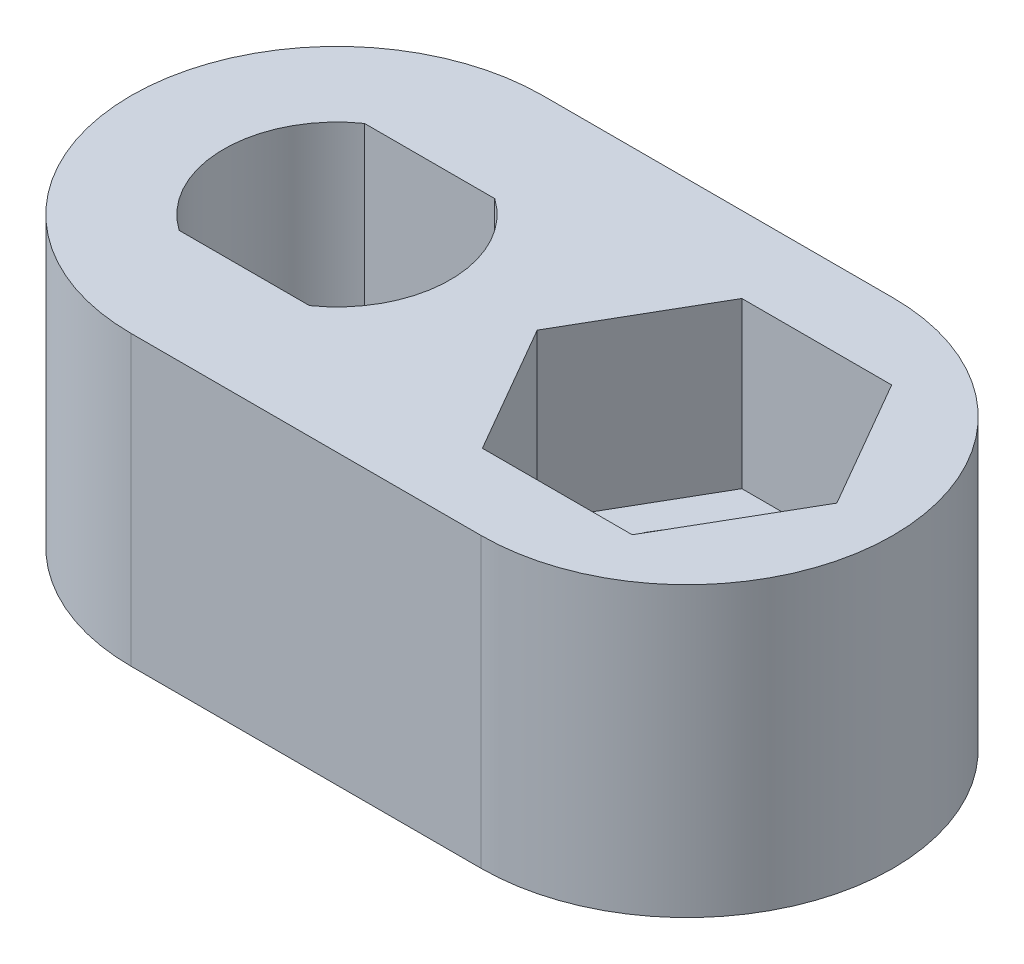
ISO-10303-21;
HEADER;
FILE_DESCRIPTION(('STEP AP214'),'2;1');
FILE_NAME('part.step','',(''),(''),'','','');
FILE_SCHEMA(('AUTOMOTIVE_DESIGN { 1 0 10303 214 1 1 1 1 }'));
ENDSEC;
DATA;
#1=APPLICATION_CONTEXT('core data for automotive mechanical design processes');
#2=APPLICATION_PROTOCOL_DEFINITION('international standard','automotive_design',2000,#1);
#3=PRODUCT_CONTEXT('',#1,'mechanical');
#4=PRODUCT('Part','Part','',(#3));
#5=PRODUCT_RELATED_PRODUCT_CATEGORY('part','',(#4));
#6=PRODUCT_DEFINITION_FORMATION('','',#4);
#7=PRODUCT_DEFINITION_CONTEXT('part definition',#1,'design');
#8=PRODUCT_DEFINITION('design','',#6,#7);
#9=PRODUCT_DEFINITION_SHAPE('','',#8);
#10=(LENGTH_UNIT() NAMED_UNIT(*) SI_UNIT(.MILLI.,.METRE.));
#11=(NAMED_UNIT(*) PLANE_ANGLE_UNIT() SI_UNIT($,.RADIAN.));
#12=(NAMED_UNIT(*) SI_UNIT($,.STERADIAN.) SOLID_ANGLE_UNIT());
#13=UNCERTAINTY_MEASURE_WITH_UNIT(LENGTH_MEASURE(1.E-05),#10,'distance_accuracy_value','');
#14=(GEOMETRIC_REPRESENTATION_CONTEXT(3) GLOBAL_UNCERTAINTY_ASSIGNED_CONTEXT((#13)) GLOBAL_UNIT_ASSIGNED_CONTEXT((#10,
#11,#12)) REPRESENTATION_CONTEXT('',''));
#15=CARTESIAN_POINT('',(0.,0.,0.));
#16=DIRECTION('',(0.,0.,1.));
#17=DIRECTION('',(1.,0.,0.));
#18=AXIS2_PLACEMENT_3D('',#15,#16,#17);
#19=CARTESIAN_POINT('',(8.5,0.,0.));
#20=DIRECTION('',(0.,-1.,0.));
#21=DIRECTION('',(0.,0.,-1.));
#22=AXIS2_PLACEMENT_3D('',#19,#20,#21);
#23=CYLINDRICAL_SURFACE('',#22,2.32500000000001);
#24=CARTESIAN_POINT('',(8.5,0.,0.));
#25=DIRECTION('',(0.,-1.,0.));
#26=DIRECTION('',(0.,0.,-1.));
#27=AXIS2_PLACEMENT_3D('',#24,#25,#26);
#28=CIRCLE('',#27,2.32500000000001);
#29=CARTESIAN_POINT('',(8.5,0.,-2.32500000000001));
#30=VERTEX_POINT('',#29);
#31=EDGE_CURVE('E216',#30,#30,#28,.T.);
#32=ORIENTED_EDGE('',*,*,#31,.T.);
#33=EDGE_LOOP('',(#32));
#34=FACE_BOUND('',#33,.T.);
#35=CARTESIAN_POINT('',(8.5,3.,0.));
#36=DIRECTION('',(0.,1.,0.));
#37=DIRECTION('',(0.,0.,1.));
#38=AXIS2_PLACEMENT_3D('',#35,#36,#37);
#39=CIRCLE('',#38,2.32500000000001);
#40=CARTESIAN_POINT('',(8.5,3.,2.32500000000001));
#41=VERTEX_POINT('',#40);
#42=EDGE_CURVE('E43',#41,#41,#39,.F.);
#43=ORIENTED_EDGE('',*,*,#42,.F.);
#44=EDGE_LOOP('',(#43));
#45=FACE_BOUND('',#44,.T.);
#46=ADVANCED_FACE('F39',(#34,#45),#23,.F.);
#47=CARTESIAN_POINT('',(0.,7.,0.));
#48=DIRECTION('',(0.,-1.,0.));
#49=DIRECTION('',(0.,0.,-1.));
#50=AXIS2_PLACEMENT_3D('',#47,#48,#49);
#51=CYLINDRICAL_SURFACE('',#50,5.);
#52=CARTESIAN_POINT('',(0.,0.,0.));
#53=DIRECTION('',(0.,1.,0.));
#54=DIRECTION('',(0.,0.,1.));
#55=AXIS2_PLACEMENT_3D('',#52,#53,#54);
#56=CIRCLE('',#55,5.);
#57=CARTESIAN_POINT('',(0.,0.,-5.));
#58=VERTEX_POINT('',#57);
#59=CARTESIAN_POINT('',(0.,0.,5.));
#60=VERTEX_POINT('',#59);
#61=EDGE_CURVE('E257',#58,#60,#56,.T.);
#62=ORIENTED_EDGE('',*,*,#61,.T.);
#63=DIRECTION('',(0.,-1.,0.));
#64=VECTOR('',#63,1.);
#65=CARTESIAN_POINT('',(0.,7.,5.));
#66=LINE('',#65,#64);
#67=CARTESIAN_POINT('',(0.,7.,5.));
#68=VERTEX_POINT('',#67);
#69=EDGE_CURVE('E11',#68,#60,#66,.T.);
#70=ORIENTED_EDGE('',*,*,#69,.F.);
#71=CARTESIAN_POINT('',(0.,7.,0.));
#72=DIRECTION('',(0.,1.,0.));
#73=DIRECTION('',(0.,0.,1.));
#74=AXIS2_PLACEMENT_3D('',#71,#72,#73);
#75=CIRCLE('',#74,5.);
#76=CARTESIAN_POINT('',(0.,7.,-5.));
#77=VERTEX_POINT('',#76);
#78=EDGE_CURVE('E266',#77,#68,#75,.T.);
#79=ORIENTED_EDGE('',*,*,#78,.F.);
#80=DIRECTION('',(0.,-1.,0.));
#81=VECTOR('',#80,1.);
#82=CARTESIAN_POINT('',(0.,7.,-5.));
#83=LINE('',#82,#81);
#84=EDGE_CURVE('E280',#77,#58,#83,.T.);
#85=ORIENTED_EDGE('',*,*,#84,.T.);
#86=EDGE_LOOP('',(#62,#70,#79,#85));
#87=FACE_BOUND('',#86,.T.);
#88=ADVANCED_FACE('F41',(#87),#51,.T.);
#89=CARTESIAN_POINT('',(0.,7.,5.));
#90=DIRECTION('',(0.,0.,-1.));
#91=DIRECTION('',(-1.,0.,0.));
#92=AXIS2_PLACEMENT_3D('',#89,#90,#91);
#93=PLANE('',#92);
#94=DIRECTION('',(1.,0.,0.));
#95=VECTOR('',#94,1.);
#96=CARTESIAN_POINT('',(0.,0.,5.));
#97=LINE('',#96,#95);
#98=CARTESIAN_POINT('',(8.5,0.,5.));
#99=VERTEX_POINT('',#98);
#100=EDGE_CURVE('E284',#60,#99,#97,.T.);
#101=ORIENTED_EDGE('',*,*,#100,.T.);
#102=DIRECTION('',(0.,-1.,0.));
#103=VECTOR('',#102,1.);
#104=CARTESIAN_POINT('',(8.5,7.,5.));
#105=LINE('',#104,#103);
#106=CARTESIAN_POINT('',(8.5,7.,5.));
#107=VERTEX_POINT('',#106);
#108=EDGE_CURVE('E49',#107,#99,#105,.T.);
#109=ORIENTED_EDGE('',*,*,#108,.F.);
#110=DIRECTION('',(1.,0.,0.));
#111=VECTOR('',#110,1.);
#112=CARTESIAN_POINT('',(0.,7.,5.));
#113=LINE('',#112,#111);
#114=EDGE_CURVE('E270',#68,#107,#113,.T.);
#115=ORIENTED_EDGE('',*,*,#114,.F.);
#116=ORIENTED_EDGE('',*,*,#69,.T.);
#117=EDGE_LOOP('',(#101,#109,#115,#116));
#118=FACE_BOUND('',#117,.T.);
#119=ADVANCED_FACE('F347',(#118),#93,.F.);
#120=CARTESIAN_POINT('',(8.5,7.,0.));
#121=DIRECTION('',(0.,-1.,0.));
#122=DIRECTION('',(0.,0.,-1.));
#123=AXIS2_PLACEMENT_3D('',#120,#121,#122);
#124=CYLINDRICAL_SURFACE('',#123,5.);
#125=CARTESIAN_POINT('',(8.5,0.,0.));
#126=DIRECTION('',(0.,1.,0.));
#127=DIRECTION('',(0.,0.,1.));
#128=AXIS2_PLACEMENT_3D('',#125,#126,#127);
#129=CIRCLE('',#128,5.);
#130=CARTESIAN_POINT('',(8.5,0.,-5.));
#131=VERTEX_POINT('',#130);
#132=EDGE_CURVE('E287',#99,#131,#129,.T.);
#133=ORIENTED_EDGE('',*,*,#132,.T.);
#134=DIRECTION('',(0.,-1.,0.));
#135=VECTOR('',#134,1.);
#136=CARTESIAN_POINT('',(8.5,7.,-5.));
#137=LINE('',#136,#135);
#138=CARTESIAN_POINT('',(8.5,7.,-5.));
#139=VERTEX_POINT('',#138);
#140=EDGE_CURVE('E295',#139,#131,#137,.T.);
#141=ORIENTED_EDGE('',*,*,#140,.F.);
#142=CARTESIAN_POINT('',(8.5,7.,0.));
#143=DIRECTION('',(0.,1.,0.));
#144=DIRECTION('',(0.,0.,1.));
#145=AXIS2_PLACEMENT_3D('',#142,#143,#144);
#146=CIRCLE('',#145,5.);
#147=EDGE_CURVE('E274',#107,#139,#146,.T.);
#148=ORIENTED_EDGE('',*,*,#147,.F.);
#149=ORIENTED_EDGE('',*,*,#108,.T.);
#150=EDGE_LOOP('',(#133,#141,#148,#149));
#151=FACE_BOUND('',#150,.T.);
#152=ADVANCED_FACE('F479',(#151),#124,.T.);
#153=CARTESIAN_POINT('',(0.,7.,-5.));
#154=DIRECTION('',(0.,0.,1.));
#155=DIRECTION('',(1.,0.,0.));
#156=AXIS2_PLACEMENT_3D('',#153,#154,#155);
#157=PLANE('',#156);
#158=DIRECTION('',(-1.,0.,0.));
#159=VECTOR('',#158,1.);
#160=CARTESIAN_POINT('',(0.,0.,-5.));
#161=LINE('',#160,#159);
#162=EDGE_CURVE('E271',#131,#58,#161,.T.);
#163=ORIENTED_EDGE('',*,*,#162,.T.);
#164=ORIENTED_EDGE('',*,*,#84,.F.);
#165=DIRECTION('',(-1.,0.,0.));
#166=VECTOR('',#165,1.);
#167=CARTESIAN_POINT('',(0.,7.,-5.));
#168=LINE('',#167,#166);
#169=EDGE_CURVE('E277',#139,#77,#168,.T.);
#170=ORIENTED_EDGE('',*,*,#169,.F.);
#171=ORIENTED_EDGE('',*,*,#140,.T.);
#172=EDGE_LOOP('',(#163,#164,#170,#171));
#173=FACE_BOUND('',#172,.T.);
#174=ADVANCED_FACE('F474',(#173),#157,.F.);
#175=CARTESIAN_POINT('',(0.,7.,0.));
#176=DIRECTION('',(0.,1.,0.));
#177=DIRECTION('',(0.,0.,1.));
#178=AXIS2_PLACEMENT_3D('',#175,#176,#177);
#179=PLANE('',#178);
#180=DIRECTION('',(-0.5,0.,-0.866025403784439));
#181=VECTOR('',#180,1.);
#182=CARTESIAN_POINT('',(12.1373066958947,7.,1.15119827571368E-12));
#183=LINE('',#182,#181);
#184=CARTESIAN_POINT('',(12.1373066958947,7.,1.15119827571368E-12));
#185=VERTEX_POINT('',#184);
#186=CARTESIAN_POINT('',(10.3186533479473,7.,-3.14999999999885));
#187=VERTEX_POINT('',#186);
#188=EDGE_CURVE('E57',#185,#187,#183,.T.);
#189=ORIENTED_EDGE('',*,*,#188,.F.);
#190=DIRECTION('',(0.5,0.,-0.866025403784439));
#191=VECTOR('',#190,1.);
#192=CARTESIAN_POINT('',(10.3186533479473,7.,3.15000000000115));
#193=LINE('',#192,#191);
#194=CARTESIAN_POINT('',(10.3186533479473,7.,3.15000000000115));
#195=VERTEX_POINT('',#194);
#196=EDGE_CURVE('E168',#195,#185,#193,.T.);
#197=ORIENTED_EDGE('',*,*,#196,.F.);
#198=DIRECTION('',(1.,0.,0.));
#199=VECTOR('',#198,1.);
#200=CARTESIAN_POINT('',(6.6813466520527,7.,3.15000000000115));
#201=LINE('',#200,#199);
#202=CARTESIAN_POINT('',(6.6813466520527,7.,3.15000000000115));
#203=VERTEX_POINT('',#202);
#204=EDGE_CURVE('E172',#203,#195,#201,.T.);
#205=ORIENTED_EDGE('',*,*,#204,.F.);
#206=DIRECTION('',(0.5,0.,0.866025403784439));
#207=VECTOR('',#206,1.);
#208=CARTESIAN_POINT('',(4.86269330410538,7.,1.15147360803774E-12));
#209=LINE('',#208,#207);
#210=CARTESIAN_POINT('',(4.86269330410538,7.,1.15147360803774E-12));
#211=VERTEX_POINT('',#210);
#212=EDGE_CURVE('E195',#211,#203,#209,.T.);
#213=ORIENTED_EDGE('',*,*,#212,.F.);
#214=DIRECTION('',(-0.5,0.,0.866025403784439));
#215=VECTOR('',#214,1.);
#216=CARTESIAN_POINT('',(6.6813466520527,7.,-3.14999999999885));
#217=LINE('',#216,#215);
#218=CARTESIAN_POINT('',(6.6813466520527,7.,-3.14999999999885));
#219=VERTEX_POINT('',#218);
#220=EDGE_CURVE('E191',#219,#211,#217,.T.);
#221=ORIENTED_EDGE('',*,*,#220,.F.);
#222=DIRECTION('',(-1.,0.,0.));
#223=VECTOR('',#222,1.);
#224=CARTESIAN_POINT('',(10.3186533479473,7.,-3.14999999999885));
#225=LINE('',#224,#223);
#226=EDGE_CURVE('E188',#187,#219,#225,.T.);
#227=ORIENTED_EDGE('',*,*,#226,.F.);
#228=EDGE_LOOP('',(#189,#197,#205,#213,#221,#227));
#229=FACE_BOUND('',#228,.T.);
#230=CARTESIAN_POINT('',(0.,7.,0.));
#231=DIRECTION('',(0.,1.,0.));
#232=DIRECTION('',(0.,0.,1.));
#233=AXIS2_PLACEMENT_3D('',#230,#231,#232);
#234=CIRCLE('',#233,2.75);
#235=CARTESIAN_POINT('',(-1.58113883008419,7.,-2.25));
#236=VERTEX_POINT('',#235);
#237=CARTESIAN_POINT('',(-1.58113883008419,7.,2.25));
#238=VERTEX_POINT('',#237);
#239=EDGE_CURVE('E65',#236,#238,#234,.T.);
#240=ORIENTED_EDGE('',*,*,#239,.F.);
#241=DIRECTION('',(-1.,0.,0.));
#242=VECTOR('',#241,1.);
#243=CARTESIAN_POINT('',(0.,7.,-2.25));
#244=LINE('',#243,#242);
#245=CARTESIAN_POINT('',(1.58113883008419,7.,-2.25));
#246=VERTEX_POINT('',#245);
#247=EDGE_CURVE('E234',#246,#236,#244,.T.);
#248=ORIENTED_EDGE('',*,*,#247,.F.);
#249=CARTESIAN_POINT('',(1.58113883008419,7.,2.25));
#250=VERTEX_POINT('',#249);
#251=EDGE_CURVE('E247',#250,#246,#234,.T.);
#252=ORIENTED_EDGE('',*,*,#251,.F.);
#253=DIRECTION('',(1.,0.,0.));
#254=VECTOR('',#253,1.);
#255=CARTESIAN_POINT('',(0.,7.,2.25));
#256=LINE('',#255,#254);
#257=EDGE_CURVE('E246',#238,#250,#256,.T.);
#258=ORIENTED_EDGE('',*,*,#257,.F.);
#259=EDGE_LOOP('',(#240,#248,#252,#258));
#260=FACE_BOUND('',#259,.T.);
#261=ORIENTED_EDGE('',*,*,#78,.T.);
#262=ORIENTED_EDGE('',*,*,#114,.T.);
#263=ORIENTED_EDGE('',*,*,#147,.T.);
#264=ORIENTED_EDGE('',*,*,#169,.T.);
#265=EDGE_LOOP('',(#261,#262,#263,#264));
#266=FACE_BOUND('',#265,.T.);
#267=ADVANCED_FACE('F329',(#229,#260,#266),#179,.T.);
#268=CARTESIAN_POINT('',(0.,0.,0.));
#269=DIRECTION('',(0.,1.,0.));
#270=DIRECTION('',(0.,0.,1.));
#271=AXIS2_PLACEMENT_3D('',#268,#269,#270);
#272=PLANE('',#271);
#273=ORIENTED_EDGE('',*,*,#31,.F.);
#274=EDGE_LOOP('',(#273));
#275=FACE_BOUND('',#274,.T.);
#276=CARTESIAN_POINT('',(0.,0.,0.));
#277=DIRECTION('',(0.,-1.,0.));
#278=DIRECTION('',(0.,0.,-1.));
#279=AXIS2_PLACEMENT_3D('',#276,#277,#278);
#280=CIRCLE('',#279,3.61);
#281=CARTESIAN_POINT('',(0.,0.,-3.61));
#282=VERTEX_POINT('',#281);
#283=EDGE_CURVE('E220',#282,#282,#280,.T.);
#284=ORIENTED_EDGE('',*,*,#283,.F.);
#285=EDGE_LOOP('',(#284));
#286=FACE_BOUND('',#285,.T.);
#287=ORIENTED_EDGE('',*,*,#61,.F.);
#288=ORIENTED_EDGE('',*,*,#162,.F.);
#289=ORIENTED_EDGE('',*,*,#132,.F.);
#290=ORIENTED_EDGE('',*,*,#100,.F.);
#291=EDGE_LOOP('',(#287,#288,#289,#290));
#292=FACE_BOUND('',#291,.T.);
#293=ADVANCED_FACE('F340',(#275,#286,#292),#272,.F.);
#294=CARTESIAN_POINT('',(0.,3.,0.));
#295=DIRECTION('',(0.,1.,0.));
#296=DIRECTION('',(0.,0.,1.));
#297=AXIS2_PLACEMENT_3D('',#294,#295,#296);
#298=CYLINDRICAL_SURFACE('',#297,2.75);
#299=ORIENTED_EDGE('',*,*,#239,.T.);
#300=DIRECTION('',(0.,1.,0.));
#301=VECTOR('',#300,1.);
#302=CARTESIAN_POINT('',(-1.58113883008419,3.,2.25));
#303=LINE('',#302,#301);
#304=CARTESIAN_POINT('',(-1.58113883008419,3.,2.25));
#305=VERTEX_POINT('',#304);
#306=EDGE_CURVE('E243',#305,#238,#303,.T.);
#307=ORIENTED_EDGE('',*,*,#306,.F.);
#308=CARTESIAN_POINT('',(0.,3.,0.));
#309=DIRECTION('',(0.,1.,0.));
#310=DIRECTION('',(0.,0.,1.));
#311=AXIS2_PLACEMENT_3D('',#308,#309,#310);
#312=CIRCLE('',#311,2.75);
#313=CARTESIAN_POINT('',(-1.58113883008419,3.,-2.25));
#314=VERTEX_POINT('',#313);
#315=EDGE_CURVE('E229',#314,#305,#312,.T.);
#316=ORIENTED_EDGE('',*,*,#315,.F.);
#317=DIRECTION('',(0.,1.,0.));
#318=VECTOR('',#317,1.);
#319=CARTESIAN_POINT('',(-1.58113883008419,3.,-2.25));
#320=LINE('',#319,#318);
#321=EDGE_CURVE('E254',#314,#236,#320,.T.);
#322=ORIENTED_EDGE('',*,*,#321,.T.);
#323=EDGE_LOOP('',(#299,#307,#316,#322));
#324=FACE_BOUND('',#323,.T.);
#325=ADVANCED_FACE('F317',(#324),#298,.F.);
#326=CARTESIAN_POINT('',(0.,3.,-2.25));
#327=DIRECTION('',(0.,0.,-1.));
#328=DIRECTION('',(-1.,0.,0.));
#329=AXIS2_PLACEMENT_3D('',#326,#327,#328);
#330=PLANE('',#329);
#331=ORIENTED_EDGE('',*,*,#247,.T.);
#332=ORIENTED_EDGE('',*,*,#321,.F.);
#333=DIRECTION('',(-1.,0.,0.));
#334=VECTOR('',#333,1.);
#335=CARTESIAN_POINT('',(0.,3.,-2.25));
#336=LINE('',#335,#334);
#337=CARTESIAN_POINT('',(1.58113883008419,3.,-2.25));
#338=VERTEX_POINT('',#337);
#339=EDGE_CURVE('E239',#338,#314,#336,.T.);
#340=ORIENTED_EDGE('',*,*,#339,.F.);
#341=DIRECTION('',(0.,1.,0.));
#342=VECTOR('',#341,1.);
#343=CARTESIAN_POINT('',(1.58113883008419,3.,-2.25));
#344=LINE('',#343,#342);
#345=EDGE_CURVE('E258',#338,#246,#344,.T.);
#346=ORIENTED_EDGE('',*,*,#345,.T.);
#347=EDGE_LOOP('',(#331,#332,#340,#346));
#348=FACE_BOUND('',#347,.T.);
#349=ADVANCED_FACE('F332',(#348),#330,.F.);
#350=ORIENTED_EDGE('',*,*,#251,.T.);
#351=ORIENTED_EDGE('',*,*,#345,.F.);
#352=CARTESIAN_POINT('',(1.58113883008419,3.,2.25));
#353=VERTEX_POINT('',#352);
#354=EDGE_CURVE('E235',#353,#338,#312,.T.);
#355=ORIENTED_EDGE('',*,*,#354,.F.);
#356=DIRECTION('',(0.,1.,0.));
#357=VECTOR('',#356,1.);
#358=CARTESIAN_POINT('',(1.58113883008419,3.,2.25));
#359=LINE('',#358,#357);
#360=EDGE_CURVE('E261',#353,#250,#359,.T.);
#361=ORIENTED_EDGE('',*,*,#360,.T.);
#362=EDGE_LOOP('',(#350,#351,#355,#361));
#363=FACE_BOUND('',#362,.T.);
#364=ADVANCED_FACE('F324',(#363),#298,.F.);
#365=CARTESIAN_POINT('',(0.,3.,2.25));
#366=DIRECTION('',(0.,0.,1.));
#367=DIRECTION('',(1.,0.,0.));
#368=AXIS2_PLACEMENT_3D('',#365,#366,#367);
#369=PLANE('',#368);
#370=ORIENTED_EDGE('',*,*,#257,.T.);
#371=ORIENTED_EDGE('',*,*,#360,.F.);
#372=DIRECTION('',(1.,0.,0.));
#373=VECTOR('',#372,1.);
#374=CARTESIAN_POINT('',(0.,3.,2.25));
#375=LINE('',#374,#373);
#376=EDGE_CURVE('E233',#305,#353,#375,.T.);
#377=ORIENTED_EDGE('',*,*,#376,.F.);
#378=ORIENTED_EDGE('',*,*,#306,.T.);
#379=EDGE_LOOP('',(#370,#371,#377,#378));
#380=FACE_BOUND('',#379,.T.);
#381=ADVANCED_FACE('F311',(#380),#369,.F.);
#382=CARTESIAN_POINT('',(0.,3.,0.));
#383=DIRECTION('',(0.,1.,0.));
#384=DIRECTION('',(0.,0.,1.));
#385=AXIS2_PLACEMENT_3D('',#382,#383,#384);
#386=PLANE('',#385);
#387=CARTESIAN_POINT('',(0.,3.,0.));
#388=DIRECTION('',(0.,1.,0.));
#389=DIRECTION('',(0.,0.,1.));
#390=AXIS2_PLACEMENT_3D('',#387,#388,#389);
#391=CIRCLE('',#390,1.95);
#392=CARTESIAN_POINT('',(0.,3.,1.95));
#393=VERTEX_POINT('',#392);
#394=EDGE_CURVE('E228',#393,#393,#391,.T.);
#395=ORIENTED_EDGE('',*,*,#394,.F.);
#396=EDGE_LOOP('',(#395));
#397=FACE_BOUND('',#396,.T.);
#398=ORIENTED_EDGE('',*,*,#315,.T.);
#399=ORIENTED_EDGE('',*,*,#376,.T.);
#400=ORIENTED_EDGE('',*,*,#354,.T.);
#401=ORIENTED_EDGE('',*,*,#339,.T.);
#402=EDGE_LOOP('',(#398,#399,#400,#401));
#403=FACE_BOUND('',#402,.T.);
#404=ADVANCED_FACE('F308',(#397,#403),#386,.T.);
#405=CARTESIAN_POINT('',(0.,0.,0.));
#406=DIRECTION('',(0.,-1.,0.));
#407=DIRECTION('',(0.,0.,-1.));
#408=AXIS2_PLACEMENT_3D('',#405,#406,#407);
#409=CYLINDRICAL_SURFACE('',#408,1.95);
#410=ORIENTED_EDGE('',*,*,#394,.T.);
#411=EDGE_LOOP('',(#410));
#412=FACE_BOUND('',#411,.T.);
#413=CARTESIAN_POINT('',(0.,1.66,0.));
#414=DIRECTION('',(0.,-1.,0.));
#415=DIRECTION('',(0.,0.,-1.));
#416=AXIS2_PLACEMENT_3D('',#413,#414,#415);
#417=CIRCLE('',#416,1.95);
#418=CARTESIAN_POINT('',(0.,1.66,-1.95));
#419=VERTEX_POINT('',#418);
#420=EDGE_CURVE('E224',#419,#419,#417,.T.);
#421=ORIENTED_EDGE('',*,*,#420,.T.);
#422=EDGE_LOOP('',(#421));
#423=FACE_BOUND('',#422,.T.);
#424=ADVANCED_FACE('F305',(#412,#423),#409,.F.);
#425=CARTESIAN_POINT('',(0.,0.,0.));
#426=DIRECTION('',(0.,-1.,0.));
#427=DIRECTION('',(0.,0.,-1.));
#428=AXIS2_PLACEMENT_3D('',#425,#426,#427);
#429=CONICAL_SURFACE('',#428,3.61,0.785398163397449);
#430=ORIENTED_EDGE('',*,*,#420,.F.);
#431=EDGE_LOOP('',(#430));
#432=FACE_BOUND('',#431,.T.);
#433=ORIENTED_EDGE('',*,*,#283,.T.);
#434=EDGE_LOOP('',(#433));
#435=FACE_BOUND('',#434,.T.);
#436=ADVANCED_FACE('F353',(#432,#435),#429,.F.);
#437=CARTESIAN_POINT('',(0.,3.,0.));
#438=DIRECTION('',(0.,1.,0.));
#439=DIRECTION('',(0.,0.,1.));
#440=AXIS2_PLACEMENT_3D('',#437,#438,#439);
#441=PLANE('',#440);
#442=DIRECTION('',(-0.5,0.,-0.866025403784439));
#443=VECTOR('',#442,1.);
#444=CARTESIAN_POINT('',(12.1373066958947,3.,1.15119827571368E-12));
#445=LINE('',#444,#443);
#446=CARTESIAN_POINT('',(12.1373066958947,3.,1.15119827571368E-12));
#447=VERTEX_POINT('',#446);
#448=CARTESIAN_POINT('',(10.3186533479473,3.,-3.14999999999885));
#449=VERTEX_POINT('',#448);
#450=EDGE_CURVE('E145',#447,#449,#445,.T.);
#451=ORIENTED_EDGE('',*,*,#450,.T.);
#452=DIRECTION('',(-1.,0.,0.));
#453=VECTOR('',#452,1.);
#454=CARTESIAN_POINT('',(10.3186533479473,3.,-3.14999999999885));
#455=LINE('',#454,#453);
#456=CARTESIAN_POINT('',(6.6813466520527,3.,-3.14999999999885));
#457=VERTEX_POINT('',#456);
#458=EDGE_CURVE('E155',#449,#457,#455,.T.);
#459=ORIENTED_EDGE('',*,*,#458,.T.);
#460=DIRECTION('',(-0.5,0.,0.866025403784439));
#461=VECTOR('',#460,1.);
#462=CARTESIAN_POINT('',(6.6813466520527,3.,-3.14999999999885));
#463=LINE('',#462,#461);
#464=CARTESIAN_POINT('',(4.86269330410538,3.,1.15147360803774E-12));
#465=VERTEX_POINT('',#464);
#466=EDGE_CURVE('E161',#457,#465,#463,.T.);
#467=ORIENTED_EDGE('',*,*,#466,.T.);
#468=DIRECTION('',(0.5,0.,0.866025403784439));
#469=VECTOR('',#468,1.);
#470=CARTESIAN_POINT('',(4.86269330410538,3.,1.15147360803774E-12));
#471=LINE('',#470,#469);
#472=CARTESIAN_POINT('',(6.6813466520527,3.,3.15000000000115));
#473=VERTEX_POINT('',#472);
#474=EDGE_CURVE('E177',#465,#473,#471,.T.);
#475=ORIENTED_EDGE('',*,*,#474,.T.);
#476=DIRECTION('',(1.,0.,0.));
#477=VECTOR('',#476,1.);
#478=CARTESIAN_POINT('',(6.6813466520527,3.,3.15000000000115));
#479=LINE('',#478,#477);
#480=CARTESIAN_POINT('',(10.3186533479473,3.,3.15000000000115));
#481=VERTEX_POINT('',#480);
#482=EDGE_CURVE('E181',#473,#481,#479,.T.);
#483=ORIENTED_EDGE('',*,*,#482,.T.);
#484=DIRECTION('',(0.5,0.,-0.866025403784439));
#485=VECTOR('',#484,1.);
#486=CARTESIAN_POINT('',(10.3186533479473,3.,3.15000000000115));
#487=LINE('',#486,#485);
#488=EDGE_CURVE('E152',#481,#447,#487,.T.);
#489=ORIENTED_EDGE('',*,*,#488,.T.);
#490=EDGE_LOOP('',(#451,#459,#467,#475,#483,#489));
#491=FACE_BOUND('',#490,.T.);
#492=ORIENTED_EDGE('',*,*,#42,.T.);
#493=EDGE_LOOP('',(#492));
#494=FACE_BOUND('',#493,.T.);
#495=ADVANCED_FACE('F163',(#491,#494),#441,.T.);
#496=CARTESIAN_POINT('',(12.1373066958947,3.,1.15119827571368E-12));
#497=DIRECTION('',(0.866025403784439,0.,-0.5));
#498=DIRECTION('',(-0.5,0.,-0.866025403784439));
#499=AXIS2_PLACEMENT_3D('',#496,#497,#498);
#500=PLANE('',#499);
#501=ORIENTED_EDGE('',*,*,#188,.T.);
#502=DIRECTION('',(0.,1.,0.));
#503=VECTOR('',#502,1.);
#504=CARTESIAN_POINT('',(10.3186533479473,3.,-3.14999999999885));
#505=LINE('',#504,#503);
#506=EDGE_CURVE('E141',#449,#187,#505,.T.);
#507=ORIENTED_EDGE('',*,*,#506,.F.);
#508=ORIENTED_EDGE('',*,*,#450,.F.);
#509=DIRECTION('',(0.,1.,0.));
#510=VECTOR('',#509,1.);
#511=CARTESIAN_POINT('',(12.1373066958947,3.,1.15119827571368E-12));
#512=LINE('',#511,#510);
#513=EDGE_CURVE('E202',#447,#185,#512,.T.);
#514=ORIENTED_EDGE('',*,*,#513,.T.);
#515=EDGE_LOOP('',(#501,#507,#508,#514));
#516=FACE_BOUND('',#515,.T.);
#517=ADVANCED_FACE('F143',(#516),#500,.F.);
#518=CARTESIAN_POINT('',(10.3186533479473,3.,3.15000000000115));
#519=DIRECTION('',(0.866025403784439,0.,0.5));
#520=DIRECTION('',(0.5,0.,-0.866025403784439));
#521=AXIS2_PLACEMENT_3D('',#518,#519,#520);
#522=PLANE('',#521);
#523=ORIENTED_EDGE('',*,*,#196,.T.);
#524=ORIENTED_EDGE('',*,*,#513,.F.);
#525=ORIENTED_EDGE('',*,*,#488,.F.);
#526=DIRECTION('',(0.,1.,0.));
#527=VECTOR('',#526,1.);
#528=CARTESIAN_POINT('',(10.3186533479473,3.,3.15000000000115));
#529=LINE('',#528,#527);
#530=EDGE_CURVE('E205',#481,#195,#529,.T.);
#531=ORIENTED_EDGE('',*,*,#530,.T.);
#532=EDGE_LOOP('',(#523,#524,#525,#531));
#533=FACE_BOUND('',#532,.T.);
#534=ADVANCED_FACE('F381',(#533),#522,.F.);
#535=CARTESIAN_POINT('',(6.6813466520527,3.,3.15000000000115));
#536=DIRECTION('',(0.,0.,1.));
#537=DIRECTION('',(1.,0.,0.));
#538=AXIS2_PLACEMENT_3D('',#535,#536,#537);
#539=PLANE('',#538);
#540=ORIENTED_EDGE('',*,*,#204,.T.);
#541=ORIENTED_EDGE('',*,*,#530,.F.);
#542=ORIENTED_EDGE('',*,*,#482,.F.);
#543=DIRECTION('',(0.,1.,0.));
#544=VECTOR('',#543,1.);
#545=CARTESIAN_POINT('',(6.6813466520527,3.,3.15000000000115));
#546=LINE('',#545,#544);
#547=EDGE_CURVE('E208',#473,#203,#546,.T.);
#548=ORIENTED_EDGE('',*,*,#547,.T.);
#549=EDGE_LOOP('',(#540,#541,#542,#548));
#550=FACE_BOUND('',#549,.T.);
#551=ADVANCED_FACE('F387',(#550),#539,.F.);
#552=CARTESIAN_POINT('',(4.86269330410538,3.,1.15147360803774E-12));
#553=DIRECTION('',(-0.866025403784439,0.,0.5));
#554=DIRECTION('',(0.5,0.,0.866025403784439));
#555=AXIS2_PLACEMENT_3D('',#552,#553,#554);
#556=PLANE('',#555);
#557=ORIENTED_EDGE('',*,*,#212,.T.);
#558=ORIENTED_EDGE('',*,*,#547,.F.);
#559=ORIENTED_EDGE('',*,*,#474,.F.);
#560=DIRECTION('',(0.,1.,0.));
#561=VECTOR('',#560,1.);
#562=CARTESIAN_POINT('',(4.86269330410538,3.,1.15147360803774E-12));
#563=LINE('',#562,#561);
#564=EDGE_CURVE('E211',#465,#211,#563,.T.);
#565=ORIENTED_EDGE('',*,*,#564,.T.);
#566=EDGE_LOOP('',(#557,#558,#559,#565));
#567=FACE_BOUND('',#566,.T.);
#568=ADVANCED_FACE('F395',(#567),#556,.F.);
#569=CARTESIAN_POINT('',(6.6813466520527,3.,-3.14999999999885));
#570=DIRECTION('',(-0.866025403784439,0.,-0.5));
#571=DIRECTION('',(-0.5,0.,0.866025403784439));
#572=AXIS2_PLACEMENT_3D('',#569,#570,#571);
#573=PLANE('',#572);
#574=ORIENTED_EDGE('',*,*,#220,.T.);
#575=ORIENTED_EDGE('',*,*,#564,.F.);
#576=ORIENTED_EDGE('',*,*,#466,.F.);
#577=DIRECTION('',(0.,1.,0.));
#578=VECTOR('',#577,1.);
#579=CARTESIAN_POINT('',(6.6813466520527,3.,-3.14999999999885));
#580=LINE('',#579,#578);
#581=EDGE_CURVE('E151',#457,#219,#580,.T.);
#582=ORIENTED_EDGE('',*,*,#581,.T.);
#583=EDGE_LOOP('',(#574,#575,#576,#582));
#584=FACE_BOUND('',#583,.T.);
#585=ADVANCED_FACE('F403',(#584),#573,.F.);
#586=CARTESIAN_POINT('',(10.3186533479473,3.,-3.14999999999885));
#587=DIRECTION('',(0.,0.,-1.));
#588=DIRECTION('',(-1.,0.,0.));
#589=AXIS2_PLACEMENT_3D('',#586,#587,#588);
#590=PLANE('',#589);
#591=ORIENTED_EDGE('',*,*,#226,.T.);
#592=ORIENTED_EDGE('',*,*,#581,.F.);
#593=ORIENTED_EDGE('',*,*,#458,.F.);
#594=ORIENTED_EDGE('',*,*,#506,.T.);
#595=EDGE_LOOP('',(#591,#592,#593,#594));
#596=FACE_BOUND('',#595,.T.);
#597=ADVANCED_FACE('F156',(#596),#590,.F.);
#598=CLOSED_SHELL('',(#46,#88,#119,#152,#174,#267,#293,#325,#349,#364,#381,#404,#424,#436,#495,
#517,#534,#551,#568,#585,#597));
#599=MANIFOLD_SOLID_BREP('B2',#598);
#600=ADVANCED_BREP_SHAPE_REPRESENTATION('',(#18,#599),#14);
#601=SHAPE_DEFINITION_REPRESENTATION(#9,#600);
ENDSEC;
END-ISO-10303-21;
